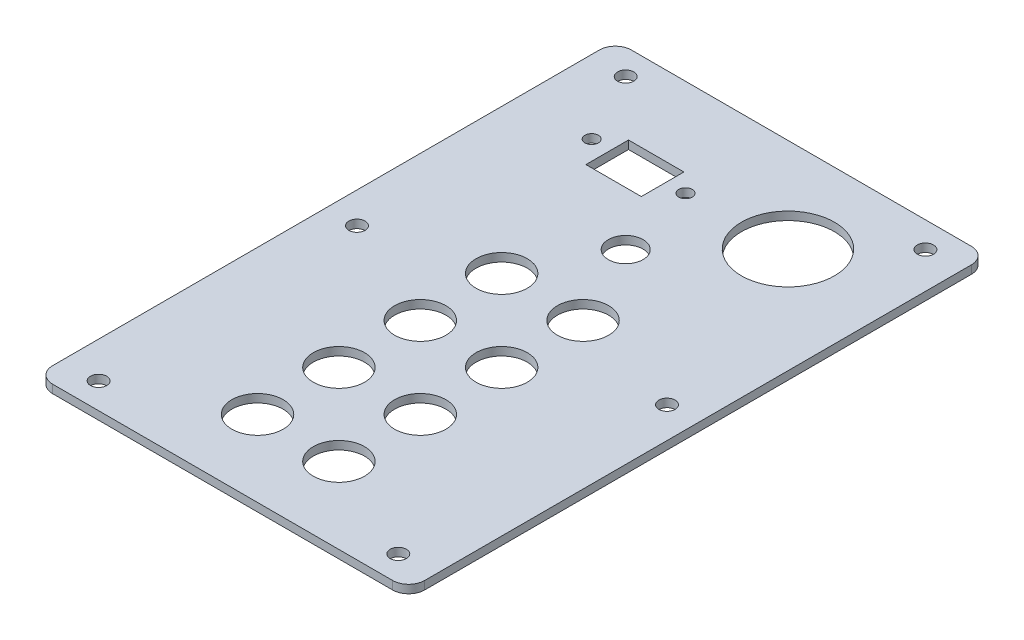
ISO-10303-21;
HEADER;
FILE_DESCRIPTION(('STEP AP214'),'2;1');
FILE_NAME('part.step','',(''),(''),'','','');
FILE_SCHEMA(('AUTOMOTIVE_DESIGN { 1 0 10303 214 1 1 1 1 }'));
ENDSEC;
DATA;
#1=APPLICATION_CONTEXT('core data for automotive mechanical design processes');
#2=APPLICATION_PROTOCOL_DEFINITION('international standard','automotive_design',2000,#1);
#3=PRODUCT_CONTEXT('',#1,'mechanical');
#4=PRODUCT('Part','Part','',(#3));
#5=PRODUCT_RELATED_PRODUCT_CATEGORY('part','',(#4));
#6=PRODUCT_DEFINITION_FORMATION('','',#4);
#7=PRODUCT_DEFINITION_CONTEXT('part definition',#1,'design');
#8=PRODUCT_DEFINITION('design','',#6,#7);
#9=PRODUCT_DEFINITION_SHAPE('','',#8);
#10=(LENGTH_UNIT() NAMED_UNIT(*) SI_UNIT(.MILLI.,.METRE.));
#11=(NAMED_UNIT(*) PLANE_ANGLE_UNIT() SI_UNIT($,.RADIAN.));
#12=(NAMED_UNIT(*) SI_UNIT($,.STERADIAN.) SOLID_ANGLE_UNIT());
#13=UNCERTAINTY_MEASURE_WITH_UNIT(LENGTH_MEASURE(1.E-05),#10,'distance_accuracy_value','');
#14=(GEOMETRIC_REPRESENTATION_CONTEXT(3) GLOBAL_UNCERTAINTY_ASSIGNED_CONTEXT((#13)) GLOBAL_UNIT_ASSIGNED_CONTEXT((#10,
#11,#12)) REPRESENTATION_CONTEXT('',''));
#15=CARTESIAN_POINT('',(0.,0.,0.));
#16=DIRECTION('',(0.,0.,1.));
#17=DIRECTION('',(1.,0.,0.));
#18=AXIS2_PLACEMENT_3D('',#15,#16,#17);
#19=CARTESIAN_POINT('',(0.,2.54,0.));
#20=DIRECTION('',(0.,-1.,0.));
#21=DIRECTION('',(0.,0.,-1.));
#22=AXIS2_PLACEMENT_3D('',#19,#20,#21);
#23=PLANE('',#22);
#24=CARTESIAN_POINT('',(-34.6309871236357,2.54,-72.0353464761879));
#25=DIRECTION('',(0.,1.,0.));
#26=DIRECTION('',(0.,0.,-1.));
#27=AXIS2_PLACEMENT_3D('',#24,#25,#26);
#28=CIRCLE('',#27,2.06375000000289);
#29=CARTESIAN_POINT('',(-34.6309871236357,2.54,-74.0990964761907));
#30=VERTEX_POINT('',#29);
#31=EDGE_CURVE('E192',#30,#30,#28,.T.);
#32=ORIENTED_EDGE('',*,*,#31,.F.);
#33=EDGE_LOOP('',(#32));
#34=FACE_BOUND('',#33,.T.);
#35=CARTESIAN_POINT('',(-5.80198712363743,2.54,-72.0353464761878));
#36=DIRECTION('',(0.,1.,0.));
#37=DIRECTION('',(0.,0.,1.));
#38=AXIS2_PLACEMENT_3D('',#35,#36,#37);
#39=CIRCLE('',#38,2.06375000000286);
#40=CARTESIAN_POINT('',(-5.80198712363743,2.54,-69.971596476185));
#41=VERTEX_POINT('',#40);
#42=EDGE_CURVE('E200',#41,#41,#39,.T.);
#43=ORIENTED_EDGE('',*,*,#42,.F.);
#44=EDGE_LOOP('',(#43));
#45=FACE_BOUND('',#44,.T.);
#46=CARTESIAN_POINT('',(-12.6999999999992,2.54,52.5418074288479));
#47=DIRECTION('',(0.,1.,0.));
#48=DIRECTION('',(0.,0.,1.));
#49=AXIS2_PLACEMENT_3D('',#46,#47,#48);
#50=CIRCLE('',#49,7.874);
#51=CARTESIAN_POINT('',(-12.6999999999992,2.54,60.4158074288479));
#52=VERTEX_POINT('',#51);
#53=EDGE_CURVE('E208',#52,#52,#50,.T.);
#54=ORIENTED_EDGE('',*,*,#53,.F.);
#55=EDGE_LOOP('',(#54));
#56=FACE_BOUND('',#55,.T.);
#57=CARTESIAN_POINT('',(-12.6999999999995,2.54,27.5418074288478));
#58=DIRECTION('',(0.,1.,0.));
#59=DIRECTION('',(0.,0.,1.));
#60=AXIS2_PLACEMENT_3D('',#57,#58,#59);
#61=CIRCLE('',#60,7.874);
#62=CARTESIAN_POINT('',(-12.6999999999995,2.54,35.4158074288478));
#63=VERTEX_POINT('',#62);
#64=EDGE_CURVE('E216',#63,#63,#61,.T.);
#65=ORIENTED_EDGE('',*,*,#64,.F.);
#66=EDGE_LOOP('',(#65));
#67=FACE_BOUND('',#66,.T.);
#68=CARTESIAN_POINT('',(-12.6999999999997,2.54,2.54180742884785));
#69=DIRECTION('',(0.,1.,0.));
#70=DIRECTION('',(0.,0.,1.));
#71=AXIS2_PLACEMENT_3D('',#68,#69,#70);
#72=CIRCLE('',#71,7.874);
#73=CARTESIAN_POINT('',(-12.6999999999997,2.54,10.4158074288478));
#74=VERTEX_POINT('',#73);
#75=EDGE_CURVE('E224',#74,#74,#72,.T.);
#76=ORIENTED_EDGE('',*,*,#75,.F.);
#77=EDGE_LOOP('',(#76));
#78=FACE_BOUND('',#77,.T.);
#79=CARTESIAN_POINT('',(-12.7,2.54,-22.4581925711522));
#80=DIRECTION('',(0.,1.,0.));
#81=DIRECTION('',(0.,0.,1.));
#82=AXIS2_PLACEMENT_3D('',#79,#80,#81);
#83=CIRCLE('',#82,7.874);
#84=CARTESIAN_POINT('',(-12.7,2.54,-14.5841925711522));
#85=VERTEX_POINT('',#84);
#86=EDGE_CURVE('E232',#85,#85,#83,.T.);
#87=ORIENTED_EDGE('',*,*,#86,.F.);
#88=EDGE_LOOP('',(#87));
#89=FACE_BOUND('',#88,.T.);
#90=CARTESIAN_POINT('',(12.3000000000008,2.54,52.5418074288479));
#91=DIRECTION('',(0.,1.,0.));
#92=DIRECTION('',(0.,0.,1.));
#93=AXIS2_PLACEMENT_3D('',#90,#91,#92);
#94=CIRCLE('',#93,7.874);
#95=CARTESIAN_POINT('',(12.3000000000008,2.54,60.4158074288479));
#96=VERTEX_POINT('',#95);
#97=EDGE_CURVE('E240',#96,#96,#94,.T.);
#98=ORIENTED_EDGE('',*,*,#97,.F.);
#99=EDGE_LOOP('',(#98));
#100=FACE_BOUND('',#99,.T.);
#101=CARTESIAN_POINT('',(12.3000000000005,2.54,27.5418074288478));
#102=DIRECTION('',(0.,1.,0.));
#103=DIRECTION('',(0.,0.,1.));
#104=AXIS2_PLACEMENT_3D('',#101,#102,#103);
#105=CIRCLE('',#104,7.874);
#106=CARTESIAN_POINT('',(12.3000000000005,2.54,35.4158074288478));
#107=VERTEX_POINT('',#106);
#108=EDGE_CURVE('E248',#107,#107,#105,.T.);
#109=ORIENTED_EDGE('',*,*,#108,.F.);
#110=EDGE_LOOP('',(#109));
#111=FACE_BOUND('',#110,.T.);
#112=CARTESIAN_POINT('',(12.3000000000003,2.54,2.54180742884785));
#113=DIRECTION('',(0.,1.,0.));
#114=DIRECTION('',(0.,0.,1.));
#115=AXIS2_PLACEMENT_3D('',#112,#113,#114);
#116=CIRCLE('',#115,7.874);
#117=CARTESIAN_POINT('',(12.3000000000003,2.54,10.4158074288478));
#118=VERTEX_POINT('',#117);
#119=EDGE_CURVE('E256',#118,#118,#116,.T.);
#120=ORIENTED_EDGE('',*,*,#119,.F.);
#121=EDGE_LOOP('',(#120));
#122=FACE_BOUND('',#121,.T.);
#123=CARTESIAN_POINT('',(12.3,2.54,-22.4581925711522));
#124=DIRECTION('',(0.,1.,0.));
#125=DIRECTION('',(0.,0.,1.));
#126=AXIS2_PLACEMENT_3D('',#123,#124,#125);
#127=CIRCLE('',#126,7.874);
#128=CARTESIAN_POINT('',(12.3,2.54,-14.5841925711522));
#129=VERTEX_POINT('',#128);
#130=EDGE_CURVE('E264',#129,#129,#127,.T.);
#131=ORIENTED_EDGE('',*,*,#130,.F.);
#132=EDGE_LOOP('',(#131));
#133=FACE_BOUND('',#132,.T.);
#134=DIRECTION('',(1.,0.,0.));
#135=VECTOR('',#134,1.);
#136=CARTESIAN_POINT('',(-57.15,2.54,75.9668074288479));
#137=LINE('',#136,#135);
#138=CARTESIAN_POINT('',(-52.23,2.54,75.9668074288479));
#139=VERTEX_POINT('',#138);
#140=CARTESIAN_POINT('',(52.23,2.54,75.9668074288479));
#141=VERTEX_POINT('',#140);
#142=EDGE_CURVE('E276',#139,#141,#137,.T.);
#143=ORIENTED_EDGE('',*,*,#142,.T.);
#144=CARTESIAN_POINT('',(52.23,2.54,71.0468074288479));
#145=DIRECTION('',(0.,-1.,0.));
#146=DIRECTION('',(0.,0.,-1.));
#147=AXIS2_PLACEMENT_3D('',#144,#145,#146);
#148=CIRCLE('',#147,4.92);
#149=CARTESIAN_POINT('',(57.15,2.54,71.0468074288479));
#150=VERTEX_POINT('',#149);
#151=EDGE_CURVE('E334',#141,#150,#148,.F.);
#152=ORIENTED_EDGE('',*,*,#151,.T.);
#153=DIRECTION('',(0.,0.,-1.));
#154=VECTOR('',#153,1.);
#155=CARTESIAN_POINT('',(57.15,2.54,75.9668074288479));
#156=LINE('',#155,#154);
#157=CARTESIAN_POINT('',(57.15,2.54,-96.9131925711521));
#158=VERTEX_POINT('',#157);
#159=EDGE_CURVE('E281',#150,#158,#156,.T.);
#160=ORIENTED_EDGE('',*,*,#159,.T.);
#161=CARTESIAN_POINT('',(52.23,2.54,-96.9131925711521));
#162=DIRECTION('',(0.,-1.,0.));
#163=DIRECTION('',(0.,0.,-1.));
#164=AXIS2_PLACEMENT_3D('',#161,#162,#163);
#165=CIRCLE('',#164,4.92);
#166=CARTESIAN_POINT('',(52.23,2.54,-101.833192571152));
#167=VERTEX_POINT('',#166);
#168=EDGE_CURVE('E66',#158,#167,#165,.F.);
#169=ORIENTED_EDGE('',*,*,#168,.T.);
#170=DIRECTION('',(-1.,0.,0.));
#171=VECTOR('',#170,1.);
#172=CARTESIAN_POINT('',(-57.15,2.54,-101.833192571152));
#173=LINE('',#172,#171);
#174=CARTESIAN_POINT('',(-52.23,2.54,-101.833192571152));
#175=VERTEX_POINT('',#174);
#176=EDGE_CURVE('E284',#167,#175,#173,.T.);
#177=ORIENTED_EDGE('',*,*,#176,.T.);
#178=CARTESIAN_POINT('',(-52.23,2.54,-96.9131925711521));
#179=DIRECTION('',(0.,-1.,0.));
#180=DIRECTION('',(0.,0.,-1.));
#181=AXIS2_PLACEMENT_3D('',#178,#179,#180);
#182=CIRCLE('',#181,4.92);
#183=CARTESIAN_POINT('',(-57.15,2.54,-96.9131925711521));
#184=VERTEX_POINT('',#183);
#185=EDGE_CURVE('E329',#175,#184,#182,.F.);
#186=ORIENTED_EDGE('',*,*,#185,.T.);
#187=DIRECTION('',(0.,0.,1.));
#188=VECTOR('',#187,1.);
#189=CARTESIAN_POINT('',(-57.15,2.54,75.9668074288479));
#190=LINE('',#189,#188);
#191=CARTESIAN_POINT('',(-57.15,2.54,71.0468074288479));
#192=VERTEX_POINT('',#191);
#193=EDGE_CURVE('E272',#184,#192,#190,.T.);
#194=ORIENTED_EDGE('',*,*,#193,.T.);
#195=CARTESIAN_POINT('',(-52.23,2.54,71.0468074288479));
#196=DIRECTION('',(0.,-1.,0.));
#197=DIRECTION('',(0.,0.,-1.));
#198=AXIS2_PLACEMENT_3D('',#195,#196,#197);
#199=CIRCLE('',#198,4.92);
#200=EDGE_CURVE('E326',#192,#139,#199,.F.);
#201=ORIENTED_EDGE('',*,*,#200,.T.);
#202=EDGE_LOOP('',(#143,#152,#160,#169,#177,#186,#194,#201));
#203=FACE_BOUND('',#202,.T.);
#204=DIRECTION('',(0.,0.,1.));
#205=VECTOR('',#204,1.);
#206=CARTESIAN_POINT('',(-28.7254871236374,2.54,-64.3667489023667));
#207=LINE('',#206,#205);
#208=CARTESIAN_POINT('',(-28.7254871236374,2.54,-77.4477489023667));
#209=VERTEX_POINT('',#208);
#210=CARTESIAN_POINT('',(-28.7254871236374,2.54,-64.3667489023667));
#211=VERTEX_POINT('',#210);
#212=EDGE_CURVE('E136',#209,#211,#207,.T.);
#213=ORIENTED_EDGE('',*,*,#212,.F.);
#214=DIRECTION('',(-1.,0.,0.));
#215=VECTOR('',#214,1.);
#216=CARTESIAN_POINT('',(-11.7074871236374,2.54,-77.4477489023667));
#217=LINE('',#216,#215);
#218=CARTESIAN_POINT('',(-11.7074871236374,2.54,-77.4477489023667));
#219=VERTEX_POINT('',#218);
#220=EDGE_CURVE('E166',#219,#209,#217,.T.);
#221=ORIENTED_EDGE('',*,*,#220,.F.);
#222=DIRECTION('',(0.,0.,-1.));
#223=VECTOR('',#222,1.);
#224=CARTESIAN_POINT('',(-11.7074871236374,2.54,-64.3667489023667));
#225=LINE('',#224,#223);
#226=CARTESIAN_POINT('',(-11.7074871236374,2.54,-64.3667489023667));
#227=VERTEX_POINT('',#226);
#228=EDGE_CURVE('E162',#227,#219,#225,.T.);
#229=ORIENTED_EDGE('',*,*,#228,.F.);
#230=DIRECTION('',(1.,0.,0.));
#231=VECTOR('',#230,1.);
#232=CARTESIAN_POINT('',(-11.7074871236374,2.54,-64.3667489023667));
#233=LINE('',#232,#231);
#234=EDGE_CURVE('E147',#211,#227,#233,.T.);
#235=ORIENTED_EDGE('',*,*,#234,.F.);
#236=EDGE_LOOP('',(#213,#221,#229,#235));
#237=FACE_BOUND('',#236,.T.);
#238=CARTESIAN_POINT('',(0.,2.54,-47.8581925711522));
#239=DIRECTION('',(0.,1.,0.));
#240=DIRECTION('',(0.,0.,1.));
#241=AXIS2_PLACEMENT_3D('',#238,#239,#240);
#242=CIRCLE('',#241,5.334);
#243=CARTESIAN_POINT('',(0.,2.54,-42.5241925711522));
#244=VERTEX_POINT('',#243);
#245=EDGE_CURVE('E175',#244,#244,#242,.T.);
#246=ORIENTED_EDGE('',*,*,#245,.F.);
#247=EDGE_LOOP('',(#246));
#248=FACE_BOUND('',#247,.T.);
#249=CARTESIAN_POINT('',(24.765,2.54,-72.9406925711522));
#250=DIRECTION('',(0.,1.,0.));
#251=DIRECTION('',(0.,0.,1.));
#252=AXIS2_PLACEMENT_3D('',#249,#250,#251);
#253=CIRCLE('',#252,14.2875);
#254=CARTESIAN_POINT('',(24.765,2.54,-58.6531925711522));
#255=VERTEX_POINT('',#254);
#256=EDGE_CURVE('E566',#255,#255,#253,.T.);
#257=ORIENTED_EDGE('',*,*,#256,.F.);
#258=EDGE_LOOP('',(#257));
#259=FACE_BOUND('',#258,.T.);
#260=CARTESIAN_POINT('',(-46.0375,2.54,68.0293074288479));
#261=DIRECTION('',(0.,1.,0.));
#262=DIRECTION('',(0.,0.,1.));
#263=AXIS2_PLACEMENT_3D('',#260,#261,#262);
#264=CIRCLE('',#263,2.4892);
#265=CARTESIAN_POINT('',(-46.0375,2.54,70.5185074288479));
#266=VERTEX_POINT('',#265);
#267=EDGE_CURVE('E559',#266,#266,#264,.T.);
#268=ORIENTED_EDGE('',*,*,#267,.F.);
#269=EDGE_LOOP('',(#268));
#270=FACE_BOUND('',#269,.T.);
#271=CARTESIAN_POINT('',(-46.0375,2.54,-93.8956925711521));
#272=DIRECTION('',(0.,1.,0.));
#273=DIRECTION('',(0.,0.,1.));
#274=AXIS2_PLACEMENT_3D('',#271,#272,#273);
#275=CIRCLE('',#274,2.4892);
#276=CARTESIAN_POINT('',(-46.0375,2.54,-91.4064925711521));
#277=VERTEX_POINT('',#276);
#278=EDGE_CURVE('E552',#277,#277,#275,.T.);
#279=ORIENTED_EDGE('',*,*,#278,.F.);
#280=EDGE_LOOP('',(#279));
#281=FACE_BOUND('',#280,.T.);
#282=CARTESIAN_POINT('',(-47.625,2.54,-12.9331925711521));
#283=DIRECTION('',(0.,1.,0.));
#284=DIRECTION('',(0.,0.,1.));
#285=AXIS2_PLACEMENT_3D('',#282,#283,#284);
#286=CIRCLE('',#285,2.4892);
#287=CARTESIAN_POINT('',(-47.625,2.54,-10.4439925711521));
#288=VERTEX_POINT('',#287);
#289=EDGE_CURVE('E545',#288,#288,#286,.T.);
#290=ORIENTED_EDGE('',*,*,#289,.F.);
#291=EDGE_LOOP('',(#290));
#292=FACE_BOUND('',#291,.T.);
#293=CARTESIAN_POINT('',(46.0375,2.54,-93.8956925711521));
#294=DIRECTION('',(0.,1.,0.));
#295=DIRECTION('',(0.,0.,-1.));
#296=AXIS2_PLACEMENT_3D('',#293,#294,#295);
#297=CIRCLE('',#296,2.4892);
#298=CARTESIAN_POINT('',(46.0375,2.54,-96.3848925711521));
#299=VERTEX_POINT('',#298);
#300=EDGE_CURVE('E538',#299,#299,#297,.T.);
#301=ORIENTED_EDGE('',*,*,#300,.F.);
#302=EDGE_LOOP('',(#301));
#303=FACE_BOUND('',#302,.T.);
#304=CARTESIAN_POINT('',(47.625,2.54,-12.9331925711521));
#305=DIRECTION('',(0.,1.,0.));
#306=DIRECTION('',(0.,0.,-1.));
#307=AXIS2_PLACEMENT_3D('',#304,#305,#306);
#308=CIRCLE('',#307,2.4892);
#309=CARTESIAN_POINT('',(47.625,2.54,-15.4223925711521));
#310=VERTEX_POINT('',#309);
#311=EDGE_CURVE('E531',#310,#310,#308,.T.);
#312=ORIENTED_EDGE('',*,*,#311,.F.);
#313=EDGE_LOOP('',(#312));
#314=FACE_BOUND('',#313,.T.);
#315=CARTESIAN_POINT('',(46.0375,2.54,68.0293074288479));
#316=DIRECTION('',(0.,1.,0.));
#317=DIRECTION('',(0.,0.,-1.));
#318=AXIS2_PLACEMENT_3D('',#315,#316,#317);
#319=CIRCLE('',#318,2.4892);
#320=CARTESIAN_POINT('',(46.0375,2.54,65.5401074288479));
#321=VERTEX_POINT('',#320);
#322=EDGE_CURVE('E525',#321,#321,#319,.T.);
#323=ORIENTED_EDGE('',*,*,#322,.F.);
#324=EDGE_LOOP('',(#323));
#325=FACE_BOUND('',#324,.T.);
#326=ADVANCED_FACE('F43',(#34,#45,#56,#67,#78,#89,#100,#111,#122,#133,#203,#237,#248,#259,#270,
#281,#292,#303,#314,#325),#23,.F.);
#327=CARTESIAN_POINT('',(0.,0.,0.));
#328=DIRECTION('',(0.,-1.,0.));
#329=DIRECTION('',(0.,0.,-1.));
#330=AXIS2_PLACEMENT_3D('',#327,#328,#329);
#331=PLANE('',#330);
#332=CARTESIAN_POINT('',(47.625,0.,-12.9331925711521));
#333=DIRECTION('',(0.,1.,0.));
#334=DIRECTION('',(0.,0.,-1.));
#335=AXIS2_PLACEMENT_3D('',#332,#333,#334);
#336=CIRCLE('',#335,2.4892);
#337=CARTESIAN_POINT('',(47.625,0.,-15.4223925711521));
#338=VERTEX_POINT('',#337);
#339=EDGE_CURVE('E528',#338,#338,#336,.T.);
#340=ORIENTED_EDGE('',*,*,#339,.T.);
#341=EDGE_LOOP('',(#340));
#342=FACE_BOUND('',#341,.T.);
#343=CARTESIAN_POINT('',(-47.625,0.,-12.9331925711521));
#344=DIRECTION('',(0.,1.,0.));
#345=DIRECTION('',(0.,0.,1.));
#346=AXIS2_PLACEMENT_3D('',#343,#344,#345);
#347=CIRCLE('',#346,2.4892);
#348=CARTESIAN_POINT('',(-47.625,0.,-10.4439925711521));
#349=VERTEX_POINT('',#348);
#350=EDGE_CURVE('E542',#349,#349,#347,.T.);
#351=ORIENTED_EDGE('',*,*,#350,.T.);
#352=EDGE_LOOP('',(#351));
#353=FACE_BOUND('',#352,.T.);
#354=CARTESIAN_POINT('',(-46.0375,0.,68.0293074288479));
#355=DIRECTION('',(0.,1.,0.));
#356=DIRECTION('',(0.,0.,1.));
#357=AXIS2_PLACEMENT_3D('',#354,#355,#356);
#358=CIRCLE('',#357,2.4892);
#359=CARTESIAN_POINT('',(-46.0375,0.,70.5185074288479));
#360=VERTEX_POINT('',#359);
#361=EDGE_CURVE('E556',#360,#360,#358,.T.);
#362=ORIENTED_EDGE('',*,*,#361,.T.);
#363=EDGE_LOOP('',(#362));
#364=FACE_BOUND('',#363,.T.);
#365=CARTESIAN_POINT('',(0.,0.,-47.8581925711522));
#366=DIRECTION('',(0.,1.,0.));
#367=DIRECTION('',(0.,0.,1.));
#368=AXIS2_PLACEMENT_3D('',#365,#366,#367);
#369=CIRCLE('',#368,5.334);
#370=CARTESIAN_POINT('',(0.,0.,-42.5241925711522));
#371=VERTEX_POINT('',#370);
#372=EDGE_CURVE('E570',#371,#371,#369,.T.);
#373=ORIENTED_EDGE('',*,*,#372,.T.);
#374=EDGE_LOOP('',(#373));
#375=FACE_BOUND('',#374,.T.);
#376=CARTESIAN_POINT('',(-5.80198712363743,0.,-72.0353464761878));
#377=DIRECTION('',(0.,1.,0.));
#378=DIRECTION('',(0.,0.,1.));
#379=AXIS2_PLACEMENT_3D('',#376,#377,#378);
#380=CIRCLE('',#379,2.06375000000286);
#381=CARTESIAN_POINT('',(-5.80198712363743,0.,-69.971596476185));
#382=VERTEX_POINT('',#381);
#383=EDGE_CURVE('E196',#382,#382,#380,.T.);
#384=ORIENTED_EDGE('',*,*,#383,.T.);
#385=EDGE_LOOP('',(#384));
#386=FACE_BOUND('',#385,.T.);
#387=CARTESIAN_POINT('',(-12.6999999999995,0.,27.5418074288478));
#388=DIRECTION('',(0.,1.,0.));
#389=DIRECTION('',(0.,0.,1.));
#390=AXIS2_PLACEMENT_3D('',#387,#388,#389);
#391=CIRCLE('',#390,7.874);
#392=CARTESIAN_POINT('',(-12.6999999999995,0.,35.4158074288478));
#393=VERTEX_POINT('',#392);
#394=EDGE_CURVE('E212',#393,#393,#391,.T.);
#395=ORIENTED_EDGE('',*,*,#394,.T.);
#396=EDGE_LOOP('',(#395));
#397=FACE_BOUND('',#396,.T.);
#398=CARTESIAN_POINT('',(-12.7,0.,-22.4581925711522));
#399=DIRECTION('',(0.,1.,0.));
#400=DIRECTION('',(0.,0.,1.));
#401=AXIS2_PLACEMENT_3D('',#398,#399,#400);
#402=CIRCLE('',#401,7.874);
#403=CARTESIAN_POINT('',(-12.7,0.,-14.5841925711522));
#404=VERTEX_POINT('',#403);
#405=EDGE_CURVE('E228',#404,#404,#402,.T.);
#406=ORIENTED_EDGE('',*,*,#405,.T.);
#407=EDGE_LOOP('',(#406));
#408=FACE_BOUND('',#407,.T.);
#409=CARTESIAN_POINT('',(12.3000000000005,0.,27.5418074288478));
#410=DIRECTION('',(0.,1.,0.));
#411=DIRECTION('',(0.,0.,1.));
#412=AXIS2_PLACEMENT_3D('',#409,#410,#411);
#413=CIRCLE('',#412,7.874);
#414=CARTESIAN_POINT('',(12.3000000000005,0.,35.4158074288478));
#415=VERTEX_POINT('',#414);
#416=EDGE_CURVE('E244',#415,#415,#413,.T.);
#417=ORIENTED_EDGE('',*,*,#416,.T.);
#418=EDGE_LOOP('',(#417));
#419=FACE_BOUND('',#418,.T.);
#420=CARTESIAN_POINT('',(12.3,0.,-22.4581925711522));
#421=DIRECTION('',(0.,1.,0.));
#422=DIRECTION('',(0.,0.,1.));
#423=AXIS2_PLACEMENT_3D('',#420,#421,#422);
#424=CIRCLE('',#423,7.874);
#425=CARTESIAN_POINT('',(12.3,0.,-14.5841925711522));
#426=VERTEX_POINT('',#425);
#427=EDGE_CURVE('E260',#426,#426,#424,.T.);
#428=ORIENTED_EDGE('',*,*,#427,.T.);
#429=EDGE_LOOP('',(#428));
#430=FACE_BOUND('',#429,.T.);
#431=DIRECTION('',(0.,0.,-1.));
#432=VECTOR('',#431,1.);
#433=CARTESIAN_POINT('',(57.15,0.,75.9668074288479));
#434=LINE('',#433,#432);
#435=CARTESIAN_POINT('',(57.15,0.,71.0468074288479));
#436=VERTEX_POINT('',#435);
#437=CARTESIAN_POINT('',(57.15,0.,-96.9131925711521));
#438=VERTEX_POINT('',#437);
#439=EDGE_CURVE('E295',#436,#438,#434,.T.);
#440=ORIENTED_EDGE('',*,*,#439,.F.);
#441=CARTESIAN_POINT('',(52.23,0.,71.0468074288479));
#442=DIRECTION('',(0.,-1.,0.));
#443=DIRECTION('',(0.,0.,-1.));
#444=AXIS2_PLACEMENT_3D('',#441,#442,#443);
#445=CIRCLE('',#444,4.92);
#446=CARTESIAN_POINT('',(52.23,0.,75.9668074288479));
#447=VERTEX_POINT('',#446);
#448=EDGE_CURVE('E316',#436,#447,#445,.T.);
#449=ORIENTED_EDGE('',*,*,#448,.T.);
#450=DIRECTION('',(1.,0.,0.));
#451=VECTOR('',#450,1.);
#452=CARTESIAN_POINT('',(-57.15,0.,75.9668074288479));
#453=LINE('',#452,#451);
#454=CARTESIAN_POINT('',(-52.23,0.,75.9668074288479));
#455=VERTEX_POINT('',#454);
#456=EDGE_CURVE('E291',#455,#447,#453,.T.);
#457=ORIENTED_EDGE('',*,*,#456,.F.);
#458=CARTESIAN_POINT('',(-52.23,0.,71.0468074288479));
#459=DIRECTION('',(0.,-1.,0.));
#460=DIRECTION('',(0.,0.,-1.));
#461=AXIS2_PLACEMENT_3D('',#458,#459,#460);
#462=CIRCLE('',#461,4.92);
#463=CARTESIAN_POINT('',(-57.15,0.,71.0468074288479));
#464=VERTEX_POINT('',#463);
#465=EDGE_CURVE('E307',#455,#464,#462,.T.);
#466=ORIENTED_EDGE('',*,*,#465,.T.);
#467=DIRECTION('',(0.,0.,1.));
#468=VECTOR('',#467,1.);
#469=CARTESIAN_POINT('',(-57.15,0.,75.9668074288479));
#470=LINE('',#469,#468);
#471=CARTESIAN_POINT('',(-57.15,0.,-96.9131925711521));
#472=VERTEX_POINT('',#471);
#473=EDGE_CURVE('E268',#472,#464,#470,.T.);
#474=ORIENTED_EDGE('',*,*,#473,.F.);
#475=CARTESIAN_POINT('',(-52.23,0.,-96.9131925711521));
#476=DIRECTION('',(0.,-1.,0.));
#477=DIRECTION('',(0.,0.,-1.));
#478=AXIS2_PLACEMENT_3D('',#475,#476,#477);
#479=CIRCLE('',#478,4.92);
#480=CARTESIAN_POINT('',(-52.23,0.,-101.833192571152));
#481=VERTEX_POINT('',#480);
#482=EDGE_CURVE('E310',#472,#481,#479,.T.);
#483=ORIENTED_EDGE('',*,*,#482,.T.);
#484=DIRECTION('',(-1.,0.,0.));
#485=VECTOR('',#484,1.);
#486=CARTESIAN_POINT('',(-57.15,0.,-101.833192571152));
#487=LINE('',#486,#485);
#488=CARTESIAN_POINT('',(52.23,0.,-101.833192571152));
#489=VERTEX_POINT('',#488);
#490=EDGE_CURVE('E277',#489,#481,#487,.T.);
#491=ORIENTED_EDGE('',*,*,#490,.F.);
#492=CARTESIAN_POINT('',(52.23,0.,-96.9131925711521));
#493=DIRECTION('',(0.,-1.,0.));
#494=DIRECTION('',(0.,0.,-1.));
#495=AXIS2_PLACEMENT_3D('',#492,#493,#494);
#496=CIRCLE('',#495,4.92);
#497=EDGE_CURVE('E313',#489,#438,#496,.T.);
#498=ORIENTED_EDGE('',*,*,#497,.T.);
#499=EDGE_LOOP('',(#440,#449,#457,#466,#474,#483,#491,#498));
#500=FACE_BOUND('',#499,.T.);
#501=CARTESIAN_POINT('',(12.3000000000003,0.,2.54180742884785));
#502=DIRECTION('',(0.,1.,0.));
#503=DIRECTION('',(0.,0.,1.));
#504=AXIS2_PLACEMENT_3D('',#501,#502,#503);
#505=CIRCLE('',#504,7.874);
#506=CARTESIAN_POINT('',(12.3000000000003,0.,10.4158074288478));
#507=VERTEX_POINT('',#506);
#508=EDGE_CURVE('E252',#507,#507,#505,.T.);
#509=ORIENTED_EDGE('',*,*,#508,.T.);
#510=EDGE_LOOP('',(#509));
#511=FACE_BOUND('',#510,.T.);
#512=CARTESIAN_POINT('',(12.3000000000008,0.,52.5418074288479));
#513=DIRECTION('',(0.,1.,0.));
#514=DIRECTION('',(0.,0.,1.));
#515=AXIS2_PLACEMENT_3D('',#512,#513,#514);
#516=CIRCLE('',#515,7.874);
#517=CARTESIAN_POINT('',(12.3000000000008,0.,60.4158074288479));
#518=VERTEX_POINT('',#517);
#519=EDGE_CURVE('E236',#518,#518,#516,.T.);
#520=ORIENTED_EDGE('',*,*,#519,.T.);
#521=EDGE_LOOP('',(#520));
#522=FACE_BOUND('',#521,.T.);
#523=CARTESIAN_POINT('',(-12.6999999999997,0.,2.54180742884785));
#524=DIRECTION('',(0.,1.,0.));
#525=DIRECTION('',(0.,0.,1.));
#526=AXIS2_PLACEMENT_3D('',#523,#524,#525);
#527=CIRCLE('',#526,7.874);
#528=CARTESIAN_POINT('',(-12.6999999999997,0.,10.4158074288478));
#529=VERTEX_POINT('',#528);
#530=EDGE_CURVE('E220',#529,#529,#527,.T.);
#531=ORIENTED_EDGE('',*,*,#530,.T.);
#532=EDGE_LOOP('',(#531));
#533=FACE_BOUND('',#532,.T.);
#534=CARTESIAN_POINT('',(-12.6999999999992,0.,52.5418074288479));
#535=DIRECTION('',(0.,1.,0.));
#536=DIRECTION('',(0.,0.,1.));
#537=AXIS2_PLACEMENT_3D('',#534,#535,#536);
#538=CIRCLE('',#537,7.874);
#539=CARTESIAN_POINT('',(-12.6999999999992,0.,60.4158074288479));
#540=VERTEX_POINT('',#539);
#541=EDGE_CURVE('E204',#540,#540,#538,.T.);
#542=ORIENTED_EDGE('',*,*,#541,.T.);
#543=EDGE_LOOP('',(#542));
#544=FACE_BOUND('',#543,.T.);
#545=CARTESIAN_POINT('',(-34.6309871236357,0.,-72.0353464761879));
#546=DIRECTION('',(0.,1.,0.));
#547=DIRECTION('',(0.,0.,-1.));
#548=AXIS2_PLACEMENT_3D('',#545,#546,#547);
#549=CIRCLE('',#548,2.06375000000289);
#550=CARTESIAN_POINT('',(-34.6309871236357,0.,-74.0990964761907));
#551=VERTEX_POINT('',#550);
#552=EDGE_CURVE('E156',#551,#551,#549,.T.);
#553=ORIENTED_EDGE('',*,*,#552,.T.);
#554=EDGE_LOOP('',(#553));
#555=FACE_BOUND('',#554,.T.);
#556=DIRECTION('',(-1.,0.,0.));
#557=VECTOR('',#556,1.);
#558=CARTESIAN_POINT('',(-11.7074871236374,0.,-77.4477489023667));
#559=LINE('',#558,#557);
#560=CARTESIAN_POINT('',(-11.7074871236374,0.,-77.4477489023667));
#561=VERTEX_POINT('',#560);
#562=CARTESIAN_POINT('',(-28.7254871236374,0.,-77.4477489023667));
#563=VERTEX_POINT('',#562);
#564=EDGE_CURVE('E148',#561,#563,#559,.T.);
#565=ORIENTED_EDGE('',*,*,#564,.T.);
#566=DIRECTION('',(0.,0.,1.));
#567=VECTOR('',#566,1.);
#568=CARTESIAN_POINT('',(-28.7254871236374,0.,-64.3667489023667));
#569=LINE('',#568,#567);
#570=CARTESIAN_POINT('',(-28.7254871236374,0.,-64.3667489023667));
#571=VERTEX_POINT('',#570);
#572=EDGE_CURVE('E172',#563,#571,#569,.T.);
#573=ORIENTED_EDGE('',*,*,#572,.T.);
#574=DIRECTION('',(1.,0.,0.));
#575=VECTOR('',#574,1.);
#576=CARTESIAN_POINT('',(-11.7074871236374,0.,-64.3667489023667));
#577=LINE('',#576,#575);
#578=CARTESIAN_POINT('',(-11.7074871236374,0.,-64.3667489023667));
#579=VERTEX_POINT('',#578);
#580=EDGE_CURVE('E154',#571,#579,#577,.T.);
#581=ORIENTED_EDGE('',*,*,#580,.T.);
#582=DIRECTION('',(0.,0.,-1.));
#583=VECTOR('',#582,1.);
#584=CARTESIAN_POINT('',(-11.7074871236374,0.,-64.3667489023667));
#585=LINE('',#584,#583);
#586=EDGE_CURVE('E178',#579,#561,#585,.T.);
#587=ORIENTED_EDGE('',*,*,#586,.T.);
#588=EDGE_LOOP('',(#565,#573,#581,#587));
#589=FACE_BOUND('',#588,.T.);
#590=CARTESIAN_POINT('',(24.765,0.,-72.9406925711522));
#591=DIRECTION('',(0.,1.,0.));
#592=DIRECTION('',(0.,0.,1.));
#593=AXIS2_PLACEMENT_3D('',#590,#591,#592);
#594=CIRCLE('',#593,14.2875);
#595=CARTESIAN_POINT('',(24.765,0.,-58.6531925711522));
#596=VERTEX_POINT('',#595);
#597=EDGE_CURVE('E512',#596,#596,#594,.T.);
#598=ORIENTED_EDGE('',*,*,#597,.T.);
#599=EDGE_LOOP('',(#598));
#600=FACE_BOUND('',#599,.T.);
#601=CARTESIAN_POINT('',(-46.0375,0.,-93.8956925711521));
#602=DIRECTION('',(0.,1.,0.));
#603=DIRECTION('',(0.,0.,1.));
#604=AXIS2_PLACEMENT_3D('',#601,#602,#603);
#605=CIRCLE('',#604,2.4892);
#606=CARTESIAN_POINT('',(-46.0375,0.,-91.4064925711521));
#607=VERTEX_POINT('',#606);
#608=EDGE_CURVE('E516',#607,#607,#605,.T.);
#609=ORIENTED_EDGE('',*,*,#608,.T.);
#610=EDGE_LOOP('',(#609));
#611=FACE_BOUND('',#610,.T.);
#612=CARTESIAN_POINT('',(46.0375,0.,-93.8956925711521));
#613=DIRECTION('',(0.,1.,0.));
#614=DIRECTION('',(0.,0.,-1.));
#615=AXIS2_PLACEMENT_3D('',#612,#613,#614);
#616=CIRCLE('',#615,2.4892);
#617=CARTESIAN_POINT('',(46.0375,0.,-96.3848925711521));
#618=VERTEX_POINT('',#617);
#619=EDGE_CURVE('E520',#618,#618,#616,.T.);
#620=ORIENTED_EDGE('',*,*,#619,.T.);
#621=EDGE_LOOP('',(#620));
#622=FACE_BOUND('',#621,.T.);
#623=CARTESIAN_POINT('',(46.0375,0.,68.0293074288479));
#624=DIRECTION('',(0.,1.,0.));
#625=DIRECTION('',(0.,0.,-1.));
#626=AXIS2_PLACEMENT_3D('',#623,#624,#625);
#627=CIRCLE('',#626,2.4892);
#628=CARTESIAN_POINT('',(46.0375,0.,65.5401074288479));
#629=VERTEX_POINT('',#628);
#630=EDGE_CURVE('E523',#629,#629,#627,.T.);
#631=ORIENTED_EDGE('',*,*,#630,.T.);
#632=EDGE_LOOP('',(#631));
#633=FACE_BOUND('',#632,.T.);
#634=ADVANCED_FACE('F360',(#342,#353,#364,#375,#386,#397,#408,#419,#430,#500,#511,#522,#533,
#544,#555,#589,#600,#611,#622,#633),#331,.T.);
#635=CARTESIAN_POINT('',(-57.15,2.54,75.9668074288479));
#636=DIRECTION('',(1.,0.,0.));
#637=DIRECTION('',(0.,0.,-1.));
#638=AXIS2_PLACEMENT_3D('',#635,#636,#637);
#639=PLANE('',#638);
#640=ORIENTED_EDGE('',*,*,#193,.F.);
#641=DIRECTION('',(0.,-1.,0.));
#642=VECTOR('',#641,1.);
#643=CARTESIAN_POINT('',(-57.15,2.54,-96.9131925711521));
#644=LINE('',#643,#642);
#645=EDGE_CURVE('E11',#184,#472,#644,.T.);
#646=ORIENTED_EDGE('',*,*,#645,.T.);
#647=ORIENTED_EDGE('',*,*,#473,.T.);
#648=DIRECTION('',(0.,-1.,0.));
#649=VECTOR('',#648,1.);
#650=CARTESIAN_POINT('',(-57.15,2.54,71.0468074288479));
#651=LINE('',#650,#649);
#652=EDGE_CURVE('E52',#464,#192,#651,.F.);
#653=ORIENTED_EDGE('',*,*,#652,.T.);
#654=EDGE_LOOP('',(#640,#646,#647,#653));
#655=FACE_BOUND('',#654,.T.);
#656=ADVANCED_FACE('F346',(#655),#639,.F.);
#657=CARTESIAN_POINT('',(-57.15,2.54,75.9668074288479));
#658=DIRECTION('',(0.,0.,-1.));
#659=DIRECTION('',(-1.,0.,0.));
#660=AXIS2_PLACEMENT_3D('',#657,#658,#659);
#661=PLANE('',#660);
#662=ORIENTED_EDGE('',*,*,#456,.T.);
#663=DIRECTION('',(0.,-1.,0.));
#664=VECTOR('',#663,1.);
#665=CARTESIAN_POINT('',(52.23,2.54,75.9668074288479));
#666=LINE('',#665,#664);
#667=EDGE_CURVE('E323',#447,#141,#666,.F.);
#668=ORIENTED_EDGE('',*,*,#667,.T.);
#669=ORIENTED_EDGE('',*,*,#142,.F.);
#670=DIRECTION('',(0.,-1.,0.));
#671=VECTOR('',#670,1.);
#672=CARTESIAN_POINT('',(-52.23,2.54,75.9668074288479));
#673=LINE('',#672,#671);
#674=EDGE_CURVE('E319',#139,#455,#673,.T.);
#675=ORIENTED_EDGE('',*,*,#674,.T.);
#676=EDGE_LOOP('',(#662,#668,#669,#675));
#677=FACE_BOUND('',#676,.T.);
#678=ADVANCED_FACE('F356',(#677),#661,.F.);
#679=CARTESIAN_POINT('',(57.15,2.54,75.9668074288479));
#680=DIRECTION('',(-1.,0.,0.));
#681=DIRECTION('',(0.,0.,1.));
#682=AXIS2_PLACEMENT_3D('',#679,#680,#681);
#683=PLANE('',#682);
#684=ORIENTED_EDGE('',*,*,#159,.F.);
#685=DIRECTION('',(0.,-1.,0.));
#686=VECTOR('',#685,1.);
#687=CARTESIAN_POINT('',(57.15,2.54,71.0468074288479));
#688=LINE('',#687,#686);
#689=EDGE_CURVE('E303',#150,#436,#688,.T.);
#690=ORIENTED_EDGE('',*,*,#689,.T.);
#691=ORIENTED_EDGE('',*,*,#439,.T.);
#692=DIRECTION('',(0.,-1.,0.));
#693=VECTOR('',#692,1.);
#694=CARTESIAN_POINT('',(57.15,2.54,-96.9131925711521));
#695=LINE('',#694,#693);
#696=EDGE_CURVE('E287',#438,#158,#695,.F.);
#697=ORIENTED_EDGE('',*,*,#696,.T.);
#698=EDGE_LOOP('',(#684,#690,#691,#697));
#699=FACE_BOUND('',#698,.T.);
#700=ADVANCED_FACE('F368',(#699),#683,.F.);
#701=CARTESIAN_POINT('',(-57.15,2.54,-101.833192571152));
#702=DIRECTION('',(0.,0.,1.));
#703=DIRECTION('',(1.,0.,0.));
#704=AXIS2_PLACEMENT_3D('',#701,#702,#703);
#705=PLANE('',#704);
#706=ORIENTED_EDGE('',*,*,#176,.F.);
#707=DIRECTION('',(0.,-1.,0.));
#708=VECTOR('',#707,1.);
#709=CARTESIAN_POINT('',(52.23,2.54,-101.833192571152));
#710=LINE('',#709,#708);
#711=EDGE_CURVE('E339',#167,#489,#710,.T.);
#712=ORIENTED_EDGE('',*,*,#711,.T.);
#713=ORIENTED_EDGE('',*,*,#490,.T.);
#714=DIRECTION('',(0.,-1.,0.));
#715=VECTOR('',#714,1.);
#716=CARTESIAN_POINT('',(-52.23,2.54,-101.833192571152));
#717=LINE('',#716,#715);
#718=EDGE_CURVE('E59',#481,#175,#717,.F.);
#719=ORIENTED_EDGE('',*,*,#718,.T.);
#720=EDGE_LOOP('',(#706,#712,#713,#719));
#721=FACE_BOUND('',#720,.T.);
#722=ADVANCED_FACE('F374',(#721),#705,.F.);
#723=CARTESIAN_POINT('',(12.3,2.54,-22.4581925711522));
#724=DIRECTION('',(0.,-1.,0.));
#725=DIRECTION('',(0.,0.,-1.));
#726=AXIS2_PLACEMENT_3D('',#723,#724,#725);
#727=CYLINDRICAL_SURFACE('',#726,7.874);
#728=ORIENTED_EDGE('',*,*,#130,.T.);
#729=EDGE_LOOP('',(#728));
#730=FACE_BOUND('',#729,.T.);
#731=ORIENTED_EDGE('',*,*,#427,.F.);
#732=EDGE_LOOP('',(#731));
#733=FACE_BOUND('',#732,.T.);
#734=ADVANCED_FACE('F394',(#730,#733),#727,.F.);
#735=CARTESIAN_POINT('',(12.3000000000003,2.54,2.54180742884785));
#736=DIRECTION('',(0.,-1.,0.));
#737=DIRECTION('',(0.,0.,-1.));
#738=AXIS2_PLACEMENT_3D('',#735,#736,#737);
#739=CYLINDRICAL_SURFACE('',#738,7.874);
#740=ORIENTED_EDGE('',*,*,#119,.T.);
#741=EDGE_LOOP('',(#740));
#742=FACE_BOUND('',#741,.T.);
#743=ORIENTED_EDGE('',*,*,#508,.F.);
#744=EDGE_LOOP('',(#743));
#745=FACE_BOUND('',#744,.T.);
#746=ADVANCED_FACE('F487',(#742,#745),#739,.F.);
#747=CARTESIAN_POINT('',(12.3000000000005,2.54,27.5418074288478));
#748=DIRECTION('',(0.,-1.,0.));
#749=DIRECTION('',(0.,0.,-1.));
#750=AXIS2_PLACEMENT_3D('',#747,#748,#749);
#751=CYLINDRICAL_SURFACE('',#750,7.874);
#752=ORIENTED_EDGE('',*,*,#108,.T.);
#753=EDGE_LOOP('',(#752));
#754=FACE_BOUND('',#753,.T.);
#755=ORIENTED_EDGE('',*,*,#416,.F.);
#756=EDGE_LOOP('',(#755));
#757=FACE_BOUND('',#756,.T.);
#758=ADVANCED_FACE('F484',(#754,#757),#751,.F.);
#759=CARTESIAN_POINT('',(12.3000000000008,2.54,52.5418074288479));
#760=DIRECTION('',(0.,-1.,0.));
#761=DIRECTION('',(0.,0.,-1.));
#762=AXIS2_PLACEMENT_3D('',#759,#760,#761);
#763=CYLINDRICAL_SURFACE('',#762,7.874);
#764=ORIENTED_EDGE('',*,*,#97,.T.);
#765=EDGE_LOOP('',(#764));
#766=FACE_BOUND('',#765,.T.);
#767=ORIENTED_EDGE('',*,*,#519,.F.);
#768=EDGE_LOOP('',(#767));
#769=FACE_BOUND('',#768,.T.);
#770=ADVANCED_FACE('F480',(#766,#769),#763,.F.);
#771=CARTESIAN_POINT('',(-12.7,2.54,-22.4581925711522));
#772=DIRECTION('',(0.,-1.,0.));
#773=DIRECTION('',(0.,0.,-1.));
#774=AXIS2_PLACEMENT_3D('',#771,#772,#773);
#775=CYLINDRICAL_SURFACE('',#774,7.874);
#776=ORIENTED_EDGE('',*,*,#86,.T.);
#777=EDGE_LOOP('',(#776));
#778=FACE_BOUND('',#777,.T.);
#779=ORIENTED_EDGE('',*,*,#405,.F.);
#780=EDGE_LOOP('',(#779));
#781=FACE_BOUND('',#780,.T.);
#782=ADVANCED_FACE('F476',(#778,#781),#775,.F.);
#783=CARTESIAN_POINT('',(-12.6999999999997,2.54,2.54180742884785));
#784=DIRECTION('',(0.,-1.,0.));
#785=DIRECTION('',(0.,0.,-1.));
#786=AXIS2_PLACEMENT_3D('',#783,#784,#785);
#787=CYLINDRICAL_SURFACE('',#786,7.874);
#788=ORIENTED_EDGE('',*,*,#75,.T.);
#789=EDGE_LOOP('',(#788));
#790=FACE_BOUND('',#789,.T.);
#791=ORIENTED_EDGE('',*,*,#530,.F.);
#792=EDGE_LOOP('',(#791));
#793=FACE_BOUND('',#792,.T.);
#794=ADVANCED_FACE('F472',(#790,#793),#787,.F.);
#795=CARTESIAN_POINT('',(-12.6999999999995,2.54,27.5418074288478));
#796=DIRECTION('',(0.,-1.,0.));
#797=DIRECTION('',(0.,0.,-1.));
#798=AXIS2_PLACEMENT_3D('',#795,#796,#797);
#799=CYLINDRICAL_SURFACE('',#798,7.874);
#800=ORIENTED_EDGE('',*,*,#64,.T.);
#801=EDGE_LOOP('',(#800));
#802=FACE_BOUND('',#801,.T.);
#803=ORIENTED_EDGE('',*,*,#394,.F.);
#804=EDGE_LOOP('',(#803));
#805=FACE_BOUND('',#804,.T.);
#806=ADVANCED_FACE('F468',(#802,#805),#799,.F.);
#807=CARTESIAN_POINT('',(-12.6999999999992,2.54,52.5418074288479));
#808=DIRECTION('',(0.,-1.,0.));
#809=DIRECTION('',(0.,0.,-1.));
#810=AXIS2_PLACEMENT_3D('',#807,#808,#809);
#811=CYLINDRICAL_SURFACE('',#810,7.874);
#812=ORIENTED_EDGE('',*,*,#53,.T.);
#813=EDGE_LOOP('',(#812));
#814=FACE_BOUND('',#813,.T.);
#815=ORIENTED_EDGE('',*,*,#541,.F.);
#816=EDGE_LOOP('',(#815));
#817=FACE_BOUND('',#816,.T.);
#818=ADVANCED_FACE('F464',(#814,#817),#811,.F.);
#819=CARTESIAN_POINT('',(-5.80198712363743,2.54,-72.0353464761878));
#820=DIRECTION('',(0.,-1.,0.));
#821=DIRECTION('',(0.,0.,-1.));
#822=AXIS2_PLACEMENT_3D('',#819,#820,#821);
#823=CYLINDRICAL_SURFACE('',#822,2.06375000000286);
#824=ORIENTED_EDGE('',*,*,#42,.T.);
#825=EDGE_LOOP('',(#824));
#826=FACE_BOUND('',#825,.T.);
#827=ORIENTED_EDGE('',*,*,#383,.F.);
#828=EDGE_LOOP('',(#827));
#829=FACE_BOUND('',#828,.T.);
#830=ADVANCED_FACE('F460',(#826,#829),#823,.F.);
#831=CARTESIAN_POINT('',(-34.6309871236357,2.54,-72.0353464761879));
#832=DIRECTION('',(0.,-1.,0.));
#833=DIRECTION('',(0.,0.,-1.));
#834=AXIS2_PLACEMENT_3D('',#831,#832,#833);
#835=CYLINDRICAL_SURFACE('',#834,2.06375000000289);
#836=ORIENTED_EDGE('',*,*,#31,.T.);
#837=EDGE_LOOP('',(#836));
#838=FACE_BOUND('',#837,.T.);
#839=ORIENTED_EDGE('',*,*,#552,.F.);
#840=EDGE_LOOP('',(#839));
#841=FACE_BOUND('',#840,.T.);
#842=ADVANCED_FACE('F457',(#838,#841),#835,.F.);
#843=CARTESIAN_POINT('',(-28.7254871236374,2.54,-64.3667489023667));
#844=DIRECTION('',(1.,0.,0.));
#845=DIRECTION('',(0.,0.,-1.));
#846=AXIS2_PLACEMENT_3D('',#843,#844,#845);
#847=PLANE('',#846);
#848=ORIENTED_EDGE('',*,*,#572,.F.);
#849=DIRECTION('',(0.,-1.,0.));
#850=VECTOR('',#849,1.);
#851=CARTESIAN_POINT('',(-28.7254871236374,2.54,-77.4477489023667));
#852=LINE('',#851,#850);
#853=EDGE_CURVE('E142',#209,#563,#852,.T.);
#854=ORIENTED_EDGE('',*,*,#853,.F.);
#855=ORIENTED_EDGE('',*,*,#212,.T.);
#856=DIRECTION('',(0.,-1.,0.));
#857=VECTOR('',#856,1.);
#858=CARTESIAN_POINT('',(-28.7254871236374,2.54,-64.3667489023667));
#859=LINE('',#858,#857);
#860=EDGE_CURVE('E139',#211,#571,#859,.T.);
#861=ORIENTED_EDGE('',*,*,#860,.T.);
#862=EDGE_LOOP('',(#848,#854,#855,#861));
#863=FACE_BOUND('',#862,.T.);
#864=ADVANCED_FACE('F138',(#863),#847,.T.);
#865=CARTESIAN_POINT('',(-11.7074871236374,2.54,-64.3667489023667));
#866=DIRECTION('',(0.,0.,-1.));
#867=DIRECTION('',(-1.,0.,0.));
#868=AXIS2_PLACEMENT_3D('',#865,#866,#867);
#869=PLANE('',#868);
#870=ORIENTED_EDGE('',*,*,#580,.F.);
#871=ORIENTED_EDGE('',*,*,#860,.F.);
#872=ORIENTED_EDGE('',*,*,#234,.T.);
#873=DIRECTION('',(0.,-1.,0.));
#874=VECTOR('',#873,1.);
#875=CARTESIAN_POINT('',(-11.7074871236374,2.54,-64.3667489023667));
#876=LINE('',#875,#874);
#877=EDGE_CURVE('E157',#227,#579,#876,.T.);
#878=ORIENTED_EDGE('',*,*,#877,.T.);
#879=EDGE_LOOP('',(#870,#871,#872,#878));
#880=FACE_BOUND('',#879,.T.);
#881=ADVANCED_FACE('F151',(#880),#869,.T.);
#882=CARTESIAN_POINT('',(-11.7074871236374,2.54,-64.3667489023667));
#883=DIRECTION('',(-1.,0.,0.));
#884=DIRECTION('',(0.,0.,1.));
#885=AXIS2_PLACEMENT_3D('',#882,#883,#884);
#886=PLANE('',#885);
#887=ORIENTED_EDGE('',*,*,#586,.F.);
#888=ORIENTED_EDGE('',*,*,#877,.F.);
#889=ORIENTED_EDGE('',*,*,#228,.T.);
#890=DIRECTION('',(0.,-1.,0.));
#891=VECTOR('',#890,1.);
#892=CARTESIAN_POINT('',(-11.7074871236374,2.54,-77.4477489023667));
#893=LINE('',#892,#891);
#894=EDGE_CURVE('E187',#219,#561,#893,.T.);
#895=ORIENTED_EDGE('',*,*,#894,.T.);
#896=EDGE_LOOP('',(#887,#888,#889,#895));
#897=FACE_BOUND('',#896,.T.);
#898=ADVANCED_FACE('F448',(#897),#886,.T.);
#899=CARTESIAN_POINT('',(-11.7074871236374,2.54,-77.4477489023667));
#900=DIRECTION('',(0.,0.,1.));
#901=DIRECTION('',(1.,0.,0.));
#902=AXIS2_PLACEMENT_3D('',#899,#900,#901);
#903=PLANE('',#902);
#904=ORIENTED_EDGE('',*,*,#564,.F.);
#905=ORIENTED_EDGE('',*,*,#894,.F.);
#906=ORIENTED_EDGE('',*,*,#220,.T.);
#907=ORIENTED_EDGE('',*,*,#853,.T.);
#908=EDGE_LOOP('',(#904,#905,#906,#907));
#909=FACE_BOUND('',#908,.T.);
#910=ADVANCED_FACE('F444',(#909),#903,.T.);
#911=CARTESIAN_POINT('',(0.,2.54,-47.8581925711522));
#912=DIRECTION('',(0.,-1.,0.));
#913=DIRECTION('',(0.,0.,-1.));
#914=AXIS2_PLACEMENT_3D('',#911,#912,#913);
#915=CYLINDRICAL_SURFACE('',#914,5.334);
#916=ORIENTED_EDGE('',*,*,#245,.T.);
#917=EDGE_LOOP('',(#916));
#918=FACE_BOUND('',#917,.T.);
#919=ORIENTED_EDGE('',*,*,#372,.F.);
#920=EDGE_LOOP('',(#919));
#921=FACE_BOUND('',#920,.T.);
#922=ADVANCED_FACE('F440',(#918,#921),#915,.F.);
#923=CARTESIAN_POINT('',(24.765,2.54,-72.9406925711522));
#924=DIRECTION('',(0.,-1.,0.));
#925=DIRECTION('',(0.,0.,-1.));
#926=AXIS2_PLACEMENT_3D('',#923,#924,#925);
#927=CYLINDRICAL_SURFACE('',#926,14.2875);
#928=ORIENTED_EDGE('',*,*,#256,.T.);
#929=EDGE_LOOP('',(#928));
#930=FACE_BOUND('',#929,.T.);
#931=ORIENTED_EDGE('',*,*,#597,.F.);
#932=EDGE_LOOP('',(#931));
#933=FACE_BOUND('',#932,.T.);
#934=ADVANCED_FACE('F436',(#930,#933),#927,.F.);
#935=CARTESIAN_POINT('',(-46.0375,2.54,68.0293074288479));
#936=DIRECTION('',(0.,-1.,0.));
#937=DIRECTION('',(0.,0.,-1.));
#938=AXIS2_PLACEMENT_3D('',#935,#936,#937);
#939=CYLINDRICAL_SURFACE('',#938,2.4892);
#940=ORIENTED_EDGE('',*,*,#267,.T.);
#941=EDGE_LOOP('',(#940));
#942=FACE_BOUND('',#941,.T.);
#943=ORIENTED_EDGE('',*,*,#361,.F.);
#944=EDGE_LOOP('',(#943));
#945=FACE_BOUND('',#944,.T.);
#946=ADVANCED_FACE('F432',(#942,#945),#939,.F.);
#947=CARTESIAN_POINT('',(-46.0375,2.54,-93.8956925711521));
#948=DIRECTION('',(0.,-1.,0.));
#949=DIRECTION('',(0.,0.,-1.));
#950=AXIS2_PLACEMENT_3D('',#947,#948,#949);
#951=CYLINDRICAL_SURFACE('',#950,2.4892);
#952=ORIENTED_EDGE('',*,*,#278,.T.);
#953=EDGE_LOOP('',(#952));
#954=FACE_BOUND('',#953,.T.);
#955=ORIENTED_EDGE('',*,*,#608,.F.);
#956=EDGE_LOOP('',(#955));
#957=FACE_BOUND('',#956,.T.);
#958=ADVANCED_FACE('F428',(#954,#957),#951,.F.);
#959=CARTESIAN_POINT('',(-47.625,2.54,-12.9331925711521));
#960=DIRECTION('',(0.,-1.,0.));
#961=DIRECTION('',(0.,0.,-1.));
#962=AXIS2_PLACEMENT_3D('',#959,#960,#961);
#963=CYLINDRICAL_SURFACE('',#962,2.4892);
#964=ORIENTED_EDGE('',*,*,#289,.T.);
#965=EDGE_LOOP('',(#964));
#966=FACE_BOUND('',#965,.T.);
#967=ORIENTED_EDGE('',*,*,#350,.F.);
#968=EDGE_LOOP('',(#967));
#969=FACE_BOUND('',#968,.T.);
#970=ADVANCED_FACE('F424',(#966,#969),#963,.F.);
#971=CARTESIAN_POINT('',(46.0375,2.54,-93.8956925711521));
#972=DIRECTION('',(0.,-1.,0.));
#973=DIRECTION('',(0.,0.,-1.));
#974=AXIS2_PLACEMENT_3D('',#971,#972,#973);
#975=CYLINDRICAL_SURFACE('',#974,2.4892);
#976=ORIENTED_EDGE('',*,*,#300,.T.);
#977=EDGE_LOOP('',(#976));
#978=FACE_BOUND('',#977,.T.);
#979=ORIENTED_EDGE('',*,*,#619,.F.);
#980=EDGE_LOOP('',(#979));
#981=FACE_BOUND('',#980,.T.);
#982=ADVANCED_FACE('F416',(#978,#981),#975,.F.);
#983=CARTESIAN_POINT('',(47.625,2.54,-12.9331925711521));
#984=DIRECTION('',(0.,-1.,0.));
#985=DIRECTION('',(0.,0.,-1.));
#986=AXIS2_PLACEMENT_3D('',#983,#984,#985);
#987=CYLINDRICAL_SURFACE('',#986,2.4892);
#988=ORIENTED_EDGE('',*,*,#311,.T.);
#989=EDGE_LOOP('',(#988));
#990=FACE_BOUND('',#989,.T.);
#991=ORIENTED_EDGE('',*,*,#339,.F.);
#992=EDGE_LOOP('',(#991));
#993=FACE_BOUND('',#992,.T.);
#994=ADVANCED_FACE('F410',(#990,#993),#987,.F.);
#995=CARTESIAN_POINT('',(46.0375,2.54,68.0293074288479));
#996=DIRECTION('',(0.,-1.,0.));
#997=DIRECTION('',(0.,0.,-1.));
#998=AXIS2_PLACEMENT_3D('',#995,#996,#997);
#999=CYLINDRICAL_SURFACE('',#998,2.4892);
#1000=ORIENTED_EDGE('',*,*,#322,.T.);
#1001=EDGE_LOOP('',(#1000));
#1002=FACE_BOUND('',#1001,.T.);
#1003=ORIENTED_EDGE('',*,*,#630,.F.);
#1004=EDGE_LOOP('',(#1003));
#1005=FACE_BOUND('',#1004,.T.);
#1006=ADVANCED_FACE('F406',(#1002,#1005),#999,.F.);
#1007=CARTESIAN_POINT('',(52.23,2.54,71.0468074288479));
#1008=DIRECTION('',(0.,-1.,0.));
#1009=DIRECTION('',(0.,0.,-1.));
#1010=AXIS2_PLACEMENT_3D('',#1007,#1008,#1009);
#1011=CYLINDRICAL_SURFACE('',#1010,4.92);
#1012=ORIENTED_EDGE('',*,*,#151,.F.);
#1013=ORIENTED_EDGE('',*,*,#667,.F.);
#1014=ORIENTED_EDGE('',*,*,#448,.F.);
#1015=ORIENTED_EDGE('',*,*,#689,.F.);
#1016=EDGE_LOOP('',(#1012,#1013,#1014,#1015));
#1017=FACE_BOUND('',#1016,.T.);
#1018=ADVANCED_FACE('F365',(#1017),#1011,.T.);
#1019=CARTESIAN_POINT('',(52.23,2.54,-96.9131925711521));
#1020=DIRECTION('',(0.,-1.,0.));
#1021=DIRECTION('',(0.,0.,-1.));
#1022=AXIS2_PLACEMENT_3D('',#1019,#1020,#1021);
#1023=CYLINDRICAL_SURFACE('',#1022,4.92);
#1024=ORIENTED_EDGE('',*,*,#168,.F.);
#1025=ORIENTED_EDGE('',*,*,#696,.F.);
#1026=ORIENTED_EDGE('',*,*,#497,.F.);
#1027=ORIENTED_EDGE('',*,*,#711,.F.);
#1028=EDGE_LOOP('',(#1024,#1025,#1026,#1027));
#1029=FACE_BOUND('',#1028,.T.);
#1030=ADVANCED_FACE('F372',(#1029),#1023,.T.);
#1031=CARTESIAN_POINT('',(-52.23,2.54,-96.9131925711521));
#1032=DIRECTION('',(0.,-1.,0.));
#1033=DIRECTION('',(0.,0.,-1.));
#1034=AXIS2_PLACEMENT_3D('',#1031,#1032,#1033);
#1035=CYLINDRICAL_SURFACE('',#1034,4.92);
#1036=ORIENTED_EDGE('',*,*,#185,.F.);
#1037=ORIENTED_EDGE('',*,*,#718,.F.);
#1038=ORIENTED_EDGE('',*,*,#482,.F.);
#1039=ORIENTED_EDGE('',*,*,#645,.F.);
#1040=EDGE_LOOP('',(#1036,#1037,#1038,#1039));
#1041=FACE_BOUND('',#1040,.T.);
#1042=ADVANCED_FACE('F376',(#1041),#1035,.T.);
#1043=CARTESIAN_POINT('',(-52.23,2.54,71.0468074288479));
#1044=DIRECTION('',(0.,-1.,0.));
#1045=DIRECTION('',(0.,0.,-1.));
#1046=AXIS2_PLACEMENT_3D('',#1043,#1044,#1045);
#1047=CYLINDRICAL_SURFACE('',#1046,4.92);
#1048=ORIENTED_EDGE('',*,*,#200,.F.);
#1049=ORIENTED_EDGE('',*,*,#652,.F.);
#1050=ORIENTED_EDGE('',*,*,#465,.F.);
#1051=ORIENTED_EDGE('',*,*,#674,.F.);
#1052=EDGE_LOOP('',(#1048,#1049,#1050,#1051));
#1053=FACE_BOUND('',#1052,.T.);
#1054=ADVANCED_FACE('F45',(#1053),#1047,.T.);
#1055=CLOSED_SHELL('',(#326,#634,#656,#678,#700,#722,#734,#746,#758,#770,#782,#794,#806,#818,
#830,#842,#864,#881,#898,#910,#922,#934,#946,#958,#970,#982,#994,#1006,#1018,#1030,#1042,#1054));
#1056=MANIFOLD_SOLID_BREP('B2',#1055);
#1057=ADVANCED_BREP_SHAPE_REPRESENTATION('',(#18,#1056),#14);
#1058=SHAPE_DEFINITION_REPRESENTATION(#9,#1057);
ENDSEC;
END-ISO-10303-21;
